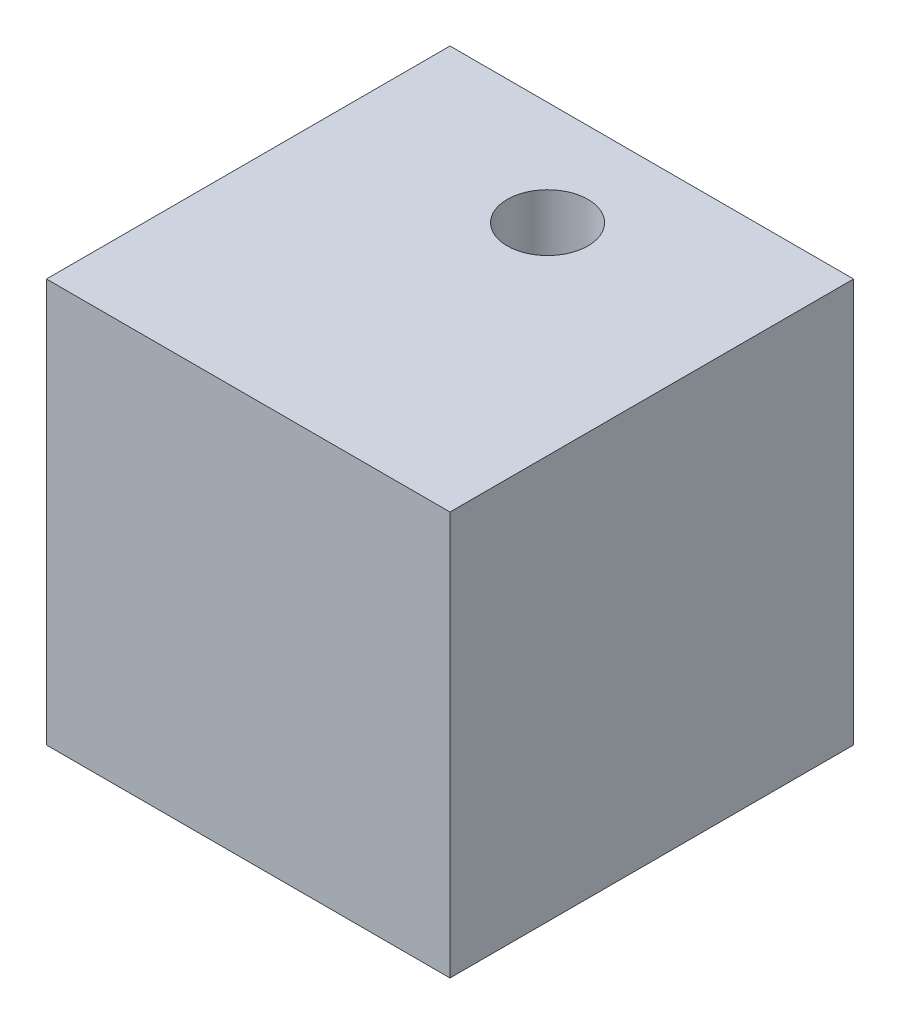
ISO-10303-21;
HEADER;
FILE_DESCRIPTION(('STEP AP214'),'2;1');
FILE_NAME('part.step','',(''),(''),'','','');
FILE_SCHEMA(('AUTOMOTIVE_DESIGN { 1 0 10303 214 1 1 1 1 }'));
ENDSEC;
DATA;
#1=APPLICATION_CONTEXT('core data for automotive mechanical design processes');
#2=APPLICATION_PROTOCOL_DEFINITION('international standard','automotive_design',2000,#1);
#3=PRODUCT_CONTEXT('',#1,'mechanical');
#4=PRODUCT('Part','Part','',(#3));
#5=PRODUCT_RELATED_PRODUCT_CATEGORY('part','',(#4));
#6=PRODUCT_DEFINITION_FORMATION('','',#4);
#7=PRODUCT_DEFINITION_CONTEXT('part definition',#1,'design');
#8=PRODUCT_DEFINITION('design','',#6,#7);
#9=PRODUCT_DEFINITION_SHAPE('','',#8);
#10=(LENGTH_UNIT() NAMED_UNIT(*) SI_UNIT(.MILLI.,.METRE.));
#11=(NAMED_UNIT(*) PLANE_ANGLE_UNIT() SI_UNIT($,.RADIAN.));
#12=(NAMED_UNIT(*) SI_UNIT($,.STERADIAN.) SOLID_ANGLE_UNIT());
#13=UNCERTAINTY_MEASURE_WITH_UNIT(LENGTH_MEASURE(1.E-05),#10,'distance_accuracy_value','');
#14=(GEOMETRIC_REPRESENTATION_CONTEXT(3) GLOBAL_UNCERTAINTY_ASSIGNED_CONTEXT((#13)) GLOBAL_UNIT_ASSIGNED_CONTEXT((#10,
#11,#12)) REPRESENTATION_CONTEXT('',''));
#15=CARTESIAN_POINT('',(0.,0.,0.));
#16=DIRECTION('',(0.,0.,1.));
#17=DIRECTION('',(1.,0.,0.));
#18=AXIS2_PLACEMENT_3D('',#15,#16,#17);
#19=CARTESIAN_POINT('',(15.,30.,-15.));
#20=DIRECTION('',(-1.,0.,0.));
#21=DIRECTION('',(0.,0.,1.));
#22=AXIS2_PLACEMENT_3D('',#19,#20,#21);
#23=PLANE('',#22);
#24=DIRECTION('',(0.,0.,-1.));
#25=VECTOR('',#24,1.);
#26=CARTESIAN_POINT('',(15.,0.,-15.));
#27=LINE('',#26,#25);
#28=CARTESIAN_POINT('',(15.,0.,15.));
#29=VERTEX_POINT('',#28);
#30=CARTESIAN_POINT('',(15.,0.,-15.));
#31=VERTEX_POINT('',#30);
#32=EDGE_CURVE('E107',#29,#31,#27,.T.);
#33=ORIENTED_EDGE('',*,*,#32,.T.);
#34=DIRECTION('',(0.,-1.,0.));
#35=VECTOR('',#34,1.);
#36=CARTESIAN_POINT('',(15.,30.,-15.));
#37=LINE('',#36,#35);
#38=CARTESIAN_POINT('',(15.,30.,-15.));
#39=VERTEX_POINT('',#38);
#40=EDGE_CURVE('E11',#39,#31,#37,.T.);
#41=ORIENTED_EDGE('',*,*,#40,.F.);
#42=DIRECTION('',(0.,0.,-1.));
#43=VECTOR('',#42,1.);
#44=CARTESIAN_POINT('',(15.,30.,-15.));
#45=LINE('',#44,#43);
#46=CARTESIAN_POINT('',(15.,30.,15.));
#47=VERTEX_POINT('',#46);
#48=EDGE_CURVE('E91',#47,#39,#45,.T.);
#49=ORIENTED_EDGE('',*,*,#48,.F.);
#50=DIRECTION('',(0.,-1.,0.));
#51=VECTOR('',#50,1.);
#52=CARTESIAN_POINT('',(15.,30.,15.));
#53=LINE('',#52,#51);
#54=EDGE_CURVE('E103',#47,#29,#53,.T.);
#55=ORIENTED_EDGE('',*,*,#54,.T.);
#56=EDGE_LOOP('',(#33,#41,#49,#55));
#57=FACE_BOUND('',#56,.T.);
#58=ADVANCED_FACE('F39',(#57),#23,.F.);
#59=CARTESIAN_POINT('',(-15.,30.,-15.));
#60=DIRECTION('',(0.,0.,1.));
#61=DIRECTION('',(1.,0.,0.));
#62=AXIS2_PLACEMENT_3D('',#59,#60,#61);
#63=PLANE('',#62);
#64=DIRECTION('',(-1.,0.,0.));
#65=VECTOR('',#64,1.);
#66=CARTESIAN_POINT('',(-15.,0.,-15.));
#67=LINE('',#66,#65);
#68=CARTESIAN_POINT('',(-15.,0.,-15.));
#69=VERTEX_POINT('',#68);
#70=EDGE_CURVE('E96',#31,#69,#67,.T.);
#71=ORIENTED_EDGE('',*,*,#70,.T.);
#72=DIRECTION('',(0.,-1.,0.));
#73=VECTOR('',#72,1.);
#74=CARTESIAN_POINT('',(-15.,30.,-15.));
#75=LINE('',#74,#73);
#76=CARTESIAN_POINT('',(-15.,30.,-15.));
#77=VERTEX_POINT('',#76);
#78=EDGE_CURVE('E48',#77,#69,#75,.T.);
#79=ORIENTED_EDGE('',*,*,#78,.F.);
#80=DIRECTION('',(-1.,0.,0.));
#81=VECTOR('',#80,1.);
#82=CARTESIAN_POINT('',(-15.,30.,-15.));
#83=LINE('',#82,#81);
#84=EDGE_CURVE('E86',#39,#77,#83,.T.);
#85=ORIENTED_EDGE('',*,*,#84,.F.);
#86=ORIENTED_EDGE('',*,*,#40,.T.);
#87=EDGE_LOOP('',(#71,#79,#85,#86));
#88=FACE_BOUND('',#87,.T.);
#89=ADVANCED_FACE('F95',(#88),#63,.F.);
#90=CARTESIAN_POINT('',(-15.,30.,-15.));
#91=DIRECTION('',(1.,0.,0.));
#92=DIRECTION('',(0.,0.,-1.));
#93=AXIS2_PLACEMENT_3D('',#90,#91,#92);
#94=PLANE('',#93);
#95=DIRECTION('',(0.,0.,1.));
#96=VECTOR('',#95,1.);
#97=CARTESIAN_POINT('',(-15.,0.,-15.));
#98=LINE('',#97,#96);
#99=CARTESIAN_POINT('',(-15.,0.,15.));
#100=VERTEX_POINT('',#99);
#101=EDGE_CURVE('E73',#69,#100,#98,.T.);
#102=ORIENTED_EDGE('',*,*,#101,.T.);
#103=DIRECTION('',(0.,-1.,0.));
#104=VECTOR('',#103,1.);
#105=CARTESIAN_POINT('',(-15.,30.,15.));
#106=LINE('',#105,#104);
#107=CARTESIAN_POINT('',(-15.,30.,15.));
#108=VERTEX_POINT('',#107);
#109=EDGE_CURVE('E98',#108,#100,#106,.T.);
#110=ORIENTED_EDGE('',*,*,#109,.F.);
#111=DIRECTION('',(0.,0.,1.));
#112=VECTOR('',#111,1.);
#113=CARTESIAN_POINT('',(-15.,30.,-15.));
#114=LINE('',#113,#112);
#115=EDGE_CURVE('E89',#77,#108,#114,.T.);
#116=ORIENTED_EDGE('',*,*,#115,.F.);
#117=ORIENTED_EDGE('',*,*,#78,.T.);
#118=EDGE_LOOP('',(#102,#110,#116,#117));
#119=FACE_BOUND('',#118,.T.);
#120=ADVANCED_FACE('F99',(#119),#94,.F.);
#121=CARTESIAN_POINT('',(-15.,30.,15.));
#122=DIRECTION('',(0.,0.,-1.));
#123=DIRECTION('',(-1.,0.,0.));
#124=AXIS2_PLACEMENT_3D('',#121,#122,#123);
#125=PLANE('',#124);
#126=DIRECTION('',(1.,0.,0.));
#127=VECTOR('',#126,1.);
#128=CARTESIAN_POINT('',(-15.,0.,15.));
#129=LINE('',#128,#127);
#130=EDGE_CURVE('E79',#100,#29,#129,.T.);
#131=ORIENTED_EDGE('',*,*,#130,.T.);
#132=ORIENTED_EDGE('',*,*,#54,.F.);
#133=DIRECTION('',(1.,0.,0.));
#134=VECTOR('',#133,1.);
#135=CARTESIAN_POINT('',(-15.,30.,15.));
#136=LINE('',#135,#134);
#137=EDGE_CURVE('E56',#108,#47,#136,.T.);
#138=ORIENTED_EDGE('',*,*,#137,.F.);
#139=ORIENTED_EDGE('',*,*,#109,.T.);
#140=EDGE_LOOP('',(#131,#132,#138,#139));
#141=FACE_BOUND('',#140,.T.);
#142=ADVANCED_FACE('F121',(#141),#125,.F.);
#143=CARTESIAN_POINT('',(0.,30.,0.));
#144=DIRECTION('',(0.,1.,0.));
#145=DIRECTION('',(0.,0.,1.));
#146=AXIS2_PLACEMENT_3D('',#143,#144,#145);
#147=PLANE('',#146);
#148=CARTESIAN_POINT('',(0.,30.,-7.25454696180812));
#149=DIRECTION('',(0.,1.,0.));
#150=DIRECTION('',(0.,0.,1.));
#151=AXIS2_PLACEMENT_3D('',#148,#149,#150);
#152=CIRCLE('',#151,3.);
#153=CARTESIAN_POINT('',(0.,30.,-4.25454696180812));
#154=VERTEX_POINT('',#153);
#155=EDGE_CURVE('E128',#154,#154,#152,.T.);
#156=ORIENTED_EDGE('',*,*,#155,.F.);
#157=EDGE_LOOP('',(#156));
#158=FACE_BOUND('',#157,.T.);
#159=ORIENTED_EDGE('',*,*,#48,.T.);
#160=ORIENTED_EDGE('',*,*,#84,.T.);
#161=ORIENTED_EDGE('',*,*,#115,.T.);
#162=ORIENTED_EDGE('',*,*,#137,.T.);
#163=EDGE_LOOP('',(#159,#160,#161,#162));
#164=FACE_BOUND('',#163,.T.);
#165=ADVANCED_FACE('F87',(#158,#164),#147,.T.);
#166=CARTESIAN_POINT('',(0.,0.,0.));
#167=DIRECTION('',(0.,1.,0.));
#168=DIRECTION('',(0.,0.,1.));
#169=AXIS2_PLACEMENT_3D('',#166,#167,#168);
#170=PLANE('',#169);
#171=ORIENTED_EDGE('',*,*,#32,.F.);
#172=ORIENTED_EDGE('',*,*,#130,.F.);
#173=ORIENTED_EDGE('',*,*,#101,.F.);
#174=ORIENTED_EDGE('',*,*,#70,.F.);
#175=EDGE_LOOP('',(#171,#172,#173,#174));
#176=FACE_BOUND('',#175,.T.);
#177=ADVANCED_FACE('F124',(#176),#170,.F.);
#178=CARTESIAN_POINT('',(0.,20.,-7.25454696180812));
#179=DIRECTION('',(0.,1.,0.));
#180=DIRECTION('',(0.,0.,1.));
#181=AXIS2_PLACEMENT_3D('',#178,#179,#180);
#182=CYLINDRICAL_SURFACE('',#181,3.);
#183=CARTESIAN_POINT('',(0.,20.,-7.25454696180812));
#184=DIRECTION('',(0.,1.,0.));
#185=DIRECTION('',(0.,0.,1.));
#186=AXIS2_PLACEMENT_3D('',#183,#184,#185);
#187=CIRCLE('',#186,3.);
#188=CARTESIAN_POINT('',(0.,20.,-4.25454696180812));
#189=VERTEX_POINT('',#188);
#190=EDGE_CURVE('E111',#189,#189,#187,.T.);
#191=ORIENTED_EDGE('',*,*,#190,.F.);
#192=EDGE_LOOP('',(#191));
#193=FACE_BOUND('',#192,.T.);
#194=ORIENTED_EDGE('',*,*,#155,.T.);
#195=EDGE_LOOP('',(#194));
#196=FACE_BOUND('',#195,.T.);
#197=ADVANCED_FACE('F138',(#193,#196),#182,.F.);
#198=CARTESIAN_POINT('',(0.,20.,-7.25454696180812));
#199=DIRECTION('',(0.,1.,0.));
#200=DIRECTION('',(0.,0.,1.));
#201=AXIS2_PLACEMENT_3D('',#198,#199,#200);
#202=PLANE('',#201);
#203=ORIENTED_EDGE('',*,*,#190,.T.);
#204=EDGE_LOOP('',(#203));
#205=FACE_BOUND('',#204,.T.);
#206=ADVANCED_FACE('F136',(#205),#202,.T.);
#207=CLOSED_SHELL('',(#58,#89,#120,#142,#165,#177,#197,#206));
#208=MANIFOLD_SOLID_BREP('B2',#207);
#209=ADVANCED_BREP_SHAPE_REPRESENTATION('',(#18,#208),#14);
#210=SHAPE_DEFINITION_REPRESENTATION(#9,#209);
ENDSEC;
END-ISO-10303-21;
